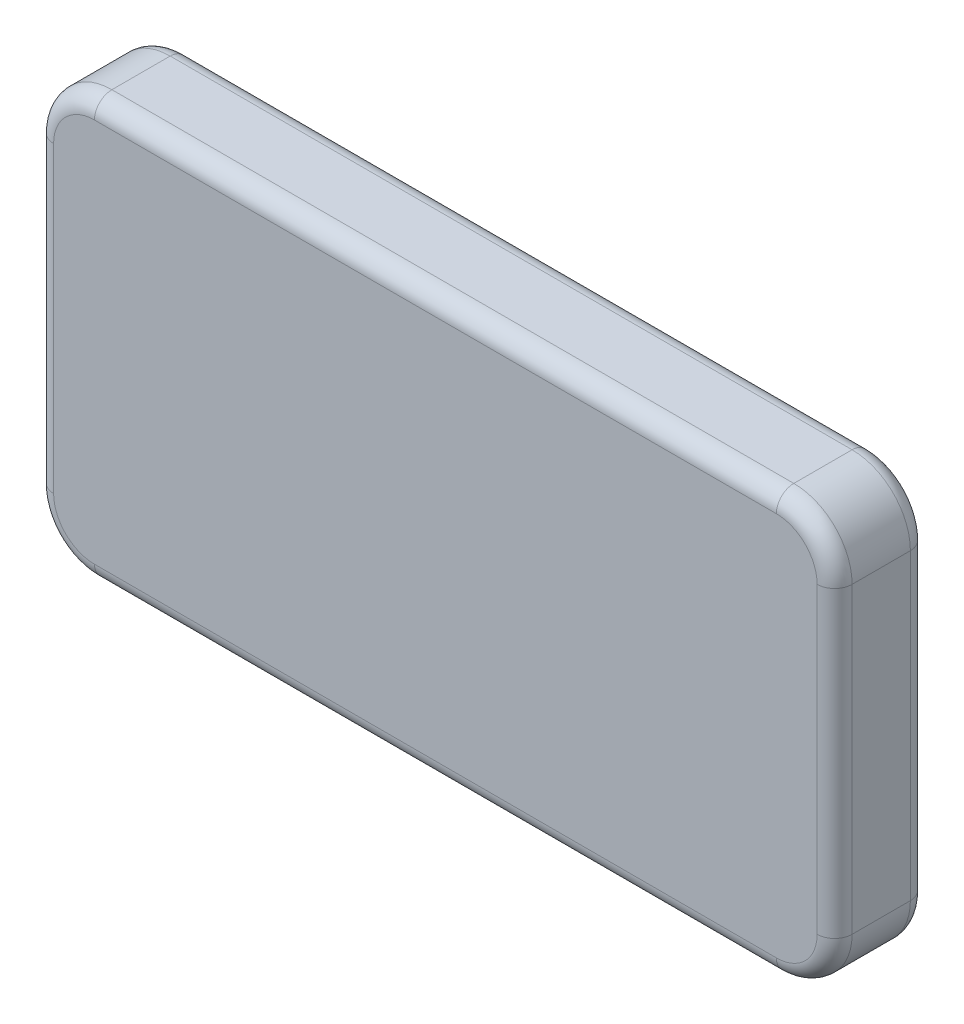
ISO-10303-21;
HEADER;
FILE_DESCRIPTION(('STEP AP214'),'2;1');
FILE_NAME('part.step','',(''),(''),'','','');
FILE_SCHEMA(('AUTOMOTIVE_DESIGN { 1 0 10303 214 1 1 1 1 }'));
ENDSEC;
DATA;
#1=APPLICATION_CONTEXT('core data for automotive mechanical design processes');
#2=APPLICATION_PROTOCOL_DEFINITION('international standard','automotive_design',2000,#1);
#3=PRODUCT_CONTEXT('',#1,'mechanical');
#4=PRODUCT('Part','Part','',(#3));
#5=PRODUCT_RELATED_PRODUCT_CATEGORY('part','',(#4));
#6=PRODUCT_DEFINITION_FORMATION('','',#4);
#7=PRODUCT_DEFINITION_CONTEXT('part definition',#1,'design');
#8=PRODUCT_DEFINITION('design','',#6,#7);
#9=PRODUCT_DEFINITION_SHAPE('','',#8);
#10=(LENGTH_UNIT() NAMED_UNIT(*) SI_UNIT(.MILLI.,.METRE.));
#11=(NAMED_UNIT(*) PLANE_ANGLE_UNIT() SI_UNIT($,.RADIAN.));
#12=(NAMED_UNIT(*) SI_UNIT($,.STERADIAN.) SOLID_ANGLE_UNIT());
#13=UNCERTAINTY_MEASURE_WITH_UNIT(LENGTH_MEASURE(1.E-05),#10,'distance_accuracy_value','');
#14=(GEOMETRIC_REPRESENTATION_CONTEXT(3) GLOBAL_UNCERTAINTY_ASSIGNED_CONTEXT((#13)) GLOBAL_UNIT_ASSIGNED_CONTEXT((#10,
#11,#12)) REPRESENTATION_CONTEXT('',''));
#15=CARTESIAN_POINT('',(0.,0.,0.));
#16=DIRECTION('',(0.,0.,1.));
#17=DIRECTION('',(1.,0.,0.));
#18=AXIS2_PLACEMENT_3D('',#15,#16,#17);
#19=CARTESIAN_POINT('',(0.,0.,16.));
#20=DIRECTION('',(-1.,0.,0.));
#21=DIRECTION('',(0.,0.,1.));
#22=AXIS2_PLACEMENT_3D('',#19,#20,#21);
#23=PLANE('',#22);
#24=DIRECTION('',(0.,0.,-1.));
#25=VECTOR('',#24,1.);
#26=CARTESIAN_POINT('',(0.,62.,16.));
#27=LINE('',#26,#25);
#28=CARTESIAN_POINT('',(0.,62.,3.));
#29=VERTEX_POINT('',#28);
#30=CARTESIAN_POINT('',(0.,62.,13.));
#31=VERTEX_POINT('',#30);
#32=EDGE_CURVE('E281',#29,#31,#27,.F.);
#33=ORIENTED_EDGE('',*,*,#32,.T.);
#34=DIRECTION('',(0.,1.,0.));
#35=VECTOR('',#34,1.);
#36=CARTESIAN_POINT('',(0.,10.,13.));
#37=LINE('',#36,#35);
#38=CARTESIAN_POINT('',(0.,10.,13.));
#39=VERTEX_POINT('',#38);
#40=EDGE_CURVE('E374',#31,#39,#37,.F.);
#41=ORIENTED_EDGE('',*,*,#40,.T.);
#42=DIRECTION('',(0.,0.,-1.));
#43=VECTOR('',#42,1.);
#44=CARTESIAN_POINT('',(0.,10.,16.));
#45=LINE('',#44,#43);
#46=CARTESIAN_POINT('',(0.,10.,3.));
#47=VERTEX_POINT('',#46);
#48=EDGE_CURVE('E284',#39,#47,#45,.T.);
#49=ORIENTED_EDGE('',*,*,#48,.T.);
#50=DIRECTION('',(0.,1.,0.));
#51=VECTOR('',#50,1.);
#52=CARTESIAN_POINT('',(0.,0.,3.));
#53=LINE('',#52,#51);
#54=EDGE_CURVE('E311',#47,#29,#53,.T.);
#55=ORIENTED_EDGE('',*,*,#54,.T.);
#56=EDGE_LOOP('',(#33,#41,#49,#55));
#57=FACE_BOUND('',#56,.T.);
#58=ADVANCED_FACE('F35',(#57),#23,.F.);
#59=CARTESIAN_POINT('',(0.,72.,16.));
#60=DIRECTION('',(0.,-1.,0.));
#61=DIRECTION('',(1.,0.,0.));
#62=AXIS2_PLACEMENT_3D('',#59,#60,#61);
#63=PLANE('',#62);
#64=DIRECTION('',(0.,0.,-1.));
#65=VECTOR('',#64,1.);
#66=CARTESIAN_POINT('',(-127.,72.,16.));
#67=LINE('',#66,#65);
#68=CARTESIAN_POINT('',(-127.,72.,3.));
#69=VERTEX_POINT('',#68);
#70=CARTESIAN_POINT('',(-127.,72.,13.));
#71=VERTEX_POINT('',#70);
#72=EDGE_CURVE('E286',#69,#71,#67,.F.);
#73=ORIENTED_EDGE('',*,*,#72,.T.);
#74=DIRECTION('',(-1.,0.,0.));
#75=VECTOR('',#74,1.);
#76=CARTESIAN_POINT('',(-10.,72.,13.));
#77=LINE('',#76,#75);
#78=CARTESIAN_POINT('',(-10.,72.,13.));
#79=VERTEX_POINT('',#78);
#80=EDGE_CURVE('E370',#71,#79,#77,.F.);
#81=ORIENTED_EDGE('',*,*,#80,.T.);
#82=DIRECTION('',(0.,0.,-1.));
#83=VECTOR('',#82,1.);
#84=CARTESIAN_POINT('',(-10.,72.,16.));
#85=LINE('',#84,#83);
#86=CARTESIAN_POINT('',(-10.,72.,3.));
#87=VERTEX_POINT('',#86);
#88=EDGE_CURVE('E289',#79,#87,#85,.T.);
#89=ORIENTED_EDGE('',*,*,#88,.T.);
#90=DIRECTION('',(-1.,0.,0.));
#91=VECTOR('',#90,1.);
#92=CARTESIAN_POINT('',(0.,72.,3.));
#93=LINE('',#92,#91);
#94=EDGE_CURVE('E316',#87,#69,#93,.T.);
#95=ORIENTED_EDGE('',*,*,#94,.T.);
#96=EDGE_LOOP('',(#73,#81,#89,#95));
#97=FACE_BOUND('',#96,.T.);
#98=ADVANCED_FACE('F449',(#97),#63,.F.);
#99=CARTESIAN_POINT('',(-137.,0.,16.));
#100=DIRECTION('',(1.,0.,0.));
#101=DIRECTION('',(0.,0.,-1.));
#102=AXIS2_PLACEMENT_3D('',#99,#100,#101);
#103=PLANE('',#102);
#104=DIRECTION('',(0.,0.,1.));
#105=VECTOR('',#104,1.);
#106=CARTESIAN_POINT('',(-137.,46.5,5.5));
#107=LINE('',#106,#105);
#108=CARTESIAN_POINT('',(-137.,46.5,5.5));
#109=VERTEX_POINT('',#108);
#110=CARTESIAN_POINT('',(-137.,46.5,10.5));
#111=VERTEX_POINT('',#110);
#112=EDGE_CURVE('E231',#109,#111,#107,.T.);
#113=ORIENTED_EDGE('',*,*,#112,.F.);
#114=DIRECTION('',(0.,-1.,0.));
#115=VECTOR('',#114,1.);
#116=CARTESIAN_POINT('',(-137.,59.,5.5));
#117=LINE('',#116,#115);
#118=CARTESIAN_POINT('',(-137.,59.,5.5));
#119=VERTEX_POINT('',#118);
#120=EDGE_CURVE('E205',#119,#109,#117,.T.);
#121=ORIENTED_EDGE('',*,*,#120,.F.);
#122=DIRECTION('',(0.,0.,-1.));
#123=VECTOR('',#122,1.);
#124=CARTESIAN_POINT('',(-137.,59.,5.5));
#125=LINE('',#124,#123);
#126=CARTESIAN_POINT('',(-137.,59.,10.5));
#127=VERTEX_POINT('',#126);
#128=EDGE_CURVE('E222',#127,#119,#125,.T.);
#129=ORIENTED_EDGE('',*,*,#128,.F.);
#130=DIRECTION('',(0.,1.,0.));
#131=VECTOR('',#130,1.);
#132=CARTESIAN_POINT('',(-137.,59.,10.5));
#133=LINE('',#132,#131);
#134=EDGE_CURVE('E225',#111,#127,#133,.T.);
#135=ORIENTED_EDGE('',*,*,#134,.F.);
#136=EDGE_LOOP('',(#113,#121,#129,#135));
#137=FACE_BOUND('',#136,.T.);
#138=DIRECTION('',(0.,0.,1.));
#139=VECTOR('',#138,1.);
#140=CARTESIAN_POINT('',(-137.,13.,5.50000000000001));
#141=LINE('',#140,#139);
#142=CARTESIAN_POINT('',(-137.,13.,5.50000000000001));
#143=VERTEX_POINT('',#142);
#144=CARTESIAN_POINT('',(-137.,13.,10.5));
#145=VERTEX_POINT('',#144);
#146=EDGE_CURVE('E258',#143,#145,#141,.T.);
#147=ORIENTED_EDGE('',*,*,#146,.F.);
#148=DIRECTION('',(0.,-1.,0.));
#149=VECTOR('',#148,1.);
#150=CARTESIAN_POINT('',(-137.,25.5,5.50000000000001));
#151=LINE('',#150,#149);
#152=CARTESIAN_POINT('',(-137.,25.5,5.50000000000001));
#153=VERTEX_POINT('',#152);
#154=EDGE_CURVE('E256',#153,#143,#151,.T.);
#155=ORIENTED_EDGE('',*,*,#154,.F.);
#156=DIRECTION('',(0.,0.,-1.));
#157=VECTOR('',#156,1.);
#158=CARTESIAN_POINT('',(-137.,25.5,5.50000000000001));
#159=LINE('',#158,#157);
#160=CARTESIAN_POINT('',(-137.,25.5,10.5));
#161=VERTEX_POINT('',#160);
#162=EDGE_CURVE('E246',#161,#153,#159,.T.);
#163=ORIENTED_EDGE('',*,*,#162,.F.);
#164=DIRECTION('',(0.,1.,0.));
#165=VECTOR('',#164,1.);
#166=CARTESIAN_POINT('',(-137.,25.5,10.5));
#167=LINE('',#166,#165);
#168=EDGE_CURVE('E262',#145,#161,#167,.T.);
#169=ORIENTED_EDGE('',*,*,#168,.F.);
#170=EDGE_LOOP('',(#147,#155,#163,#169));
#171=FACE_BOUND('',#170,.T.);
#172=DIRECTION('',(0.,0.,-1.));
#173=VECTOR('',#172,1.);
#174=CARTESIAN_POINT('',(-137.,9.99999999999998,16.));
#175=LINE('',#174,#173);
#176=CARTESIAN_POINT('',(-137.,9.99999999999998,3.));
#177=VERTEX_POINT('',#176);
#178=CARTESIAN_POINT('',(-137.,9.99999999999998,13.));
#179=VERTEX_POINT('',#178);
#180=EDGE_CURVE('E279',#177,#179,#175,.F.);
#181=ORIENTED_EDGE('',*,*,#180,.T.);
#182=DIRECTION('',(0.,-1.,0.));
#183=VECTOR('',#182,1.);
#184=CARTESIAN_POINT('',(-137.,62.,13.));
#185=LINE('',#184,#183);
#186=CARTESIAN_POINT('',(-137.,62.,13.));
#187=VERTEX_POINT('',#186);
#188=EDGE_CURVE('E11',#179,#187,#185,.F.);
#189=ORIENTED_EDGE('',*,*,#188,.T.);
#190=DIRECTION('',(0.,0.,-1.));
#191=VECTOR('',#190,1.);
#192=CARTESIAN_POINT('',(-137.,62.,16.));
#193=LINE('',#192,#191);
#194=CARTESIAN_POINT('',(-137.,62.,3.));
#195=VERTEX_POINT('',#194);
#196=EDGE_CURVE('E277',#187,#195,#193,.T.);
#197=ORIENTED_EDGE('',*,*,#196,.T.);
#198=DIRECTION('',(0.,-1.,0.));
#199=VECTOR('',#198,1.);
#200=CARTESIAN_POINT('',(-137.,0.,3.));
#201=LINE('',#200,#199);
#202=EDGE_CURVE('E321',#195,#177,#201,.T.);
#203=ORIENTED_EDGE('',*,*,#202,.T.);
#204=EDGE_LOOP('',(#181,#189,#197,#203));
#205=FACE_BOUND('',#204,.T.);
#206=ADVANCED_FACE('F466',(#137,#171,#205),#103,.F.);
#207=CARTESIAN_POINT('',(0.,0.,16.));
#208=DIRECTION('',(0.,1.,0.));
#209=DIRECTION('',(-1.,0.,0.));
#210=AXIS2_PLACEMENT_3D('',#207,#208,#209);
#211=PLANE('',#210);
#212=DIRECTION('',(0.,0.,-1.));
#213=VECTOR('',#212,1.);
#214=CARTESIAN_POINT('',(-10.,0.,16.));
#215=LINE('',#214,#213);
#216=CARTESIAN_POINT('',(-10.,0.,3.));
#217=VERTEX_POINT('',#216);
#218=CARTESIAN_POINT('',(-10.,0.,13.));
#219=VERTEX_POINT('',#218);
#220=EDGE_CURVE('E238',#217,#219,#215,.F.);
#221=ORIENTED_EDGE('',*,*,#220,.T.);
#222=DIRECTION('',(1.,0.,0.));
#223=VECTOR('',#222,1.);
#224=CARTESIAN_POINT('',(-127.,0.,13.));
#225=LINE('',#224,#223);
#226=CARTESIAN_POINT('',(-127.,0.,13.));
#227=VERTEX_POINT('',#226);
#228=EDGE_CURVE('E59',#219,#227,#225,.F.);
#229=ORIENTED_EDGE('',*,*,#228,.T.);
#230=DIRECTION('',(0.,0.,-1.));
#231=VECTOR('',#230,1.);
#232=CARTESIAN_POINT('',(-127.,0.,16.));
#233=LINE('',#232,#231);
#234=CARTESIAN_POINT('',(-127.,0.,3.));
#235=VERTEX_POINT('',#234);
#236=EDGE_CURVE('E275',#227,#235,#233,.T.);
#237=ORIENTED_EDGE('',*,*,#236,.T.);
#238=DIRECTION('',(1.,0.,0.));
#239=VECTOR('',#238,1.);
#240=CARTESIAN_POINT('',(0.,0.,3.));
#241=LINE('',#240,#239);
#242=EDGE_CURVE('E326',#235,#217,#241,.T.);
#243=ORIENTED_EDGE('',*,*,#242,.T.);
#244=EDGE_LOOP('',(#221,#229,#237,#243));
#245=FACE_BOUND('',#244,.T.);
#246=ADVANCED_FACE('F415',(#245),#211,.F.);
#247=CARTESIAN_POINT('',(0.,0.,16.));
#248=DIRECTION('',(0.,0.,1.));
#249=DIRECTION('',(1.,0.,0.));
#250=AXIS2_PLACEMENT_3D('',#247,#248,#249);
#251=PLANE('',#250);
#252=DIRECTION('',(-1.,0.,0.));
#253=VECTOR('',#252,1.);
#254=CARTESIAN_POINT('',(-127.,69.,16.));
#255=LINE('',#254,#253);
#256=CARTESIAN_POINT('',(-10.,69.,16.));
#257=VERTEX_POINT('',#256);
#258=CARTESIAN_POINT('',(-127.,69.,16.));
#259=VERTEX_POINT('',#258);
#260=EDGE_CURVE('E362',#257,#259,#255,.T.);
#261=ORIENTED_EDGE('',*,*,#260,.T.);
#262=CARTESIAN_POINT('',(-127.,62.,16.));
#263=DIRECTION('',(0.,0.,1.));
#264=DIRECTION('',(1.,0.,0.));
#265=AXIS2_PLACEMENT_3D('',#262,#263,#264);
#266=CIRCLE('',#265,7.);
#267=CARTESIAN_POINT('',(-134.,62.,16.));
#268=VERTEX_POINT('',#267);
#269=EDGE_CURVE('E364',#259,#268,#266,.T.);
#270=ORIENTED_EDGE('',*,*,#269,.T.);
#271=DIRECTION('',(0.,-1.,0.));
#272=VECTOR('',#271,1.);
#273=CARTESIAN_POINT('',(-134.,9.99999999999998,16.));
#274=LINE('',#273,#272);
#275=CARTESIAN_POINT('',(-134.,9.99999999999998,16.));
#276=VERTEX_POINT('',#275);
#277=EDGE_CURVE('E328',#268,#276,#274,.T.);
#278=ORIENTED_EDGE('',*,*,#277,.T.);
#279=CARTESIAN_POINT('',(-127.,9.99999999999998,16.));
#280=DIRECTION('',(0.,0.,1.));
#281=DIRECTION('',(1.,0.,0.));
#282=AXIS2_PLACEMENT_3D('',#279,#280,#281);
#283=CIRCLE('',#282,7.);
#284=CARTESIAN_POINT('',(-127.,2.99999999999998,16.));
#285=VERTEX_POINT('',#284);
#286=EDGE_CURVE('E352',#276,#285,#283,.T.);
#287=ORIENTED_EDGE('',*,*,#286,.T.);
#288=DIRECTION('',(1.,0.,0.));
#289=VECTOR('',#288,1.);
#290=CARTESIAN_POINT('',(-10.,3.,16.));
#291=LINE('',#290,#289);
#292=CARTESIAN_POINT('',(-10.,3.,16.));
#293=VERTEX_POINT('',#292);
#294=EDGE_CURVE('E354',#285,#293,#291,.T.);
#295=ORIENTED_EDGE('',*,*,#294,.T.);
#296=CARTESIAN_POINT('',(-10.,10.,16.));
#297=DIRECTION('',(0.,0.,1.));
#298=DIRECTION('',(1.,0.,0.));
#299=AXIS2_PLACEMENT_3D('',#296,#297,#298);
#300=CIRCLE('',#299,7.);
#301=CARTESIAN_POINT('',(-3.,10.,16.));
#302=VERTEX_POINT('',#301);
#303=EDGE_CURVE('E356',#293,#302,#300,.T.);
#304=ORIENTED_EDGE('',*,*,#303,.T.);
#305=DIRECTION('',(0.,1.,0.));
#306=VECTOR('',#305,1.);
#307=CARTESIAN_POINT('',(-3.,62.,16.));
#308=LINE('',#307,#306);
#309=CARTESIAN_POINT('',(-3.,62.,16.));
#310=VERTEX_POINT('',#309);
#311=EDGE_CURVE('E358',#302,#310,#308,.T.);
#312=ORIENTED_EDGE('',*,*,#311,.T.);
#313=CARTESIAN_POINT('',(-10.,62.,16.));
#314=DIRECTION('',(0.,0.,1.));
#315=DIRECTION('',(1.,0.,0.));
#316=AXIS2_PLACEMENT_3D('',#313,#314,#315);
#317=CIRCLE('',#316,7.);
#318=EDGE_CURVE('E360',#310,#257,#317,.T.);
#319=ORIENTED_EDGE('',*,*,#318,.T.);
#320=EDGE_LOOP('',(#261,#270,#278,#287,#295,#304,#312,#319));
#321=FACE_BOUND('',#320,.T.);
#322=ADVANCED_FACE('F477',(#321),#251,.T.);
#323=CARTESIAN_POINT('',(0.,0.,0.));
#324=DIRECTION('',(0.,0.,1.));
#325=DIRECTION('',(1.,0.,0.));
#326=AXIS2_PLACEMENT_3D('',#323,#324,#325);
#327=PLANE('',#326);
#328=DIRECTION('',(0.,1.,0.));
#329=VECTOR('',#328,1.);
#330=CARTESIAN_POINT('',(-3.,0.,0.));
#331=LINE('',#330,#329);
#332=CARTESIAN_POINT('',(-3.,62.,0.));
#333=VERTEX_POINT('',#332);
#334=CARTESIAN_POINT('',(-3.,10.,0.));
#335=VERTEX_POINT('',#334);
#336=EDGE_CURVE('E303',#333,#335,#331,.F.);
#337=ORIENTED_EDGE('',*,*,#336,.T.);
#338=CARTESIAN_POINT('',(-10.,10.,0.));
#339=DIRECTION('',(0.,0.,1.));
#340=DIRECTION('',(1.,0.,0.));
#341=AXIS2_PLACEMENT_3D('',#338,#339,#340);
#342=CIRCLE('',#341,7.);
#343=CARTESIAN_POINT('',(-10.,3.,0.));
#344=VERTEX_POINT('',#343);
#345=EDGE_CURVE('E305',#335,#344,#342,.F.);
#346=ORIENTED_EDGE('',*,*,#345,.T.);
#347=DIRECTION('',(1.,0.,0.));
#348=VECTOR('',#347,1.);
#349=CARTESIAN_POINT('',(0.,3.,0.));
#350=LINE('',#349,#348);
#351=CARTESIAN_POINT('',(-127.,2.99999999999998,0.));
#352=VERTEX_POINT('',#351);
#353=EDGE_CURVE('E291',#344,#352,#350,.F.);
#354=ORIENTED_EDGE('',*,*,#353,.T.);
#355=CARTESIAN_POINT('',(-127.,9.99999999999998,0.));
#356=DIRECTION('',(0.,0.,1.));
#357=DIRECTION('',(1.,0.,0.));
#358=AXIS2_PLACEMENT_3D('',#355,#356,#357);
#359=CIRCLE('',#358,7.);
#360=CARTESIAN_POINT('',(-134.,9.99999999999998,0.));
#361=VERTEX_POINT('',#360);
#362=EDGE_CURVE('E293',#352,#361,#359,.F.);
#363=ORIENTED_EDGE('',*,*,#362,.T.);
#364=DIRECTION('',(0.,-1.,0.));
#365=VECTOR('',#364,1.);
#366=CARTESIAN_POINT('',(-134.,0.,0.));
#367=LINE('',#366,#365);
#368=CARTESIAN_POINT('',(-134.,62.,0.));
#369=VERTEX_POINT('',#368);
#370=EDGE_CURVE('E295',#361,#369,#367,.F.);
#371=ORIENTED_EDGE('',*,*,#370,.T.);
#372=CARTESIAN_POINT('',(-127.,62.,0.));
#373=DIRECTION('',(0.,0.,1.));
#374=DIRECTION('',(1.,0.,0.));
#375=AXIS2_PLACEMENT_3D('',#372,#373,#374);
#376=CIRCLE('',#375,7.);
#377=CARTESIAN_POINT('',(-127.,69.,0.));
#378=VERTEX_POINT('',#377);
#379=EDGE_CURVE('E297',#369,#378,#376,.F.);
#380=ORIENTED_EDGE('',*,*,#379,.T.);
#381=DIRECTION('',(-1.,0.,0.));
#382=VECTOR('',#381,1.);
#383=CARTESIAN_POINT('',(0.,69.,0.));
#384=LINE('',#383,#382);
#385=CARTESIAN_POINT('',(-10.,69.,0.));
#386=VERTEX_POINT('',#385);
#387=EDGE_CURVE('E299',#378,#386,#384,.F.);
#388=ORIENTED_EDGE('',*,*,#387,.T.);
#389=CARTESIAN_POINT('',(-10.,62.,0.));
#390=DIRECTION('',(0.,0.,1.));
#391=DIRECTION('',(1.,0.,0.));
#392=AXIS2_PLACEMENT_3D('',#389,#390,#391);
#393=CIRCLE('',#392,7.);
#394=EDGE_CURVE('E301',#386,#333,#393,.F.);
#395=ORIENTED_EDGE('',*,*,#394,.T.);
#396=EDGE_LOOP('',(#337,#346,#354,#363,#371,#380,#388,#395));
#397=FACE_BOUND('',#396,.T.);
#398=ADVANCED_FACE('F474',(#397),#327,.F.);
#399=CARTESIAN_POINT('',(-125.,25.5,5.50000000000001));
#400=DIRECTION('',(0.,0.,-1.));
#401=DIRECTION('',(0.,1.,0.));
#402=AXIS2_PLACEMENT_3D('',#399,#400,#401);
#403=PLANE('',#402);
#404=ORIENTED_EDGE('',*,*,#154,.T.);
#405=DIRECTION('',(-1.,0.,0.));
#406=VECTOR('',#405,1.);
#407=CARTESIAN_POINT('',(-125.,13.,5.50000000000001));
#408=LINE('',#407,#406);
#409=CARTESIAN_POINT('',(-125.,13.,5.50000000000001));
#410=VERTEX_POINT('',#409);
#411=EDGE_CURVE('E255',#410,#143,#408,.T.);
#412=ORIENTED_EDGE('',*,*,#411,.F.);
#413=DIRECTION('',(0.,-1.,0.));
#414=VECTOR('',#413,1.);
#415=CARTESIAN_POINT('',(-125.,25.5,5.50000000000001));
#416=LINE('',#415,#414);
#417=CARTESIAN_POINT('',(-125.,25.5,5.50000000000001));
#418=VERTEX_POINT('',#417);
#419=EDGE_CURVE('E242',#418,#410,#416,.T.);
#420=ORIENTED_EDGE('',*,*,#419,.F.);
#421=DIRECTION('',(-1.,0.,0.));
#422=VECTOR('',#421,1.);
#423=CARTESIAN_POINT('',(-125.,25.5,5.50000000000001));
#424=LINE('',#423,#422);
#425=EDGE_CURVE('E232',#418,#153,#424,.T.);
#426=ORIENTED_EDGE('',*,*,#425,.T.);
#427=EDGE_LOOP('',(#404,#412,#420,#426));
#428=FACE_BOUND('',#427,.T.);
#429=ADVANCED_FACE('F476',(#428),#403,.F.);
#430=CARTESIAN_POINT('',(-125.,25.5,5.50000000000001));
#431=DIRECTION('',(0.,1.,0.));
#432=DIRECTION('',(0.,0.,1.));
#433=AXIS2_PLACEMENT_3D('',#430,#431,#432);
#434=PLANE('',#433);
#435=ORIENTED_EDGE('',*,*,#162,.T.);
#436=ORIENTED_EDGE('',*,*,#425,.F.);
#437=DIRECTION('',(0.,0.,-1.));
#438=VECTOR('',#437,1.);
#439=CARTESIAN_POINT('',(-125.,25.5,5.50000000000001));
#440=LINE('',#439,#438);
#441=CARTESIAN_POINT('',(-125.,25.5,10.5));
#442=VERTEX_POINT('',#441);
#443=EDGE_CURVE('E252',#442,#418,#440,.T.);
#444=ORIENTED_EDGE('',*,*,#443,.F.);
#445=DIRECTION('',(-1.,0.,0.));
#446=VECTOR('',#445,1.);
#447=CARTESIAN_POINT('',(-125.,25.5,10.5));
#448=LINE('',#447,#446);
#449=EDGE_CURVE('E268',#442,#161,#448,.T.);
#450=ORIENTED_EDGE('',*,*,#449,.T.);
#451=EDGE_LOOP('',(#435,#436,#444,#450));
#452=FACE_BOUND('',#451,.T.);
#453=ADVANCED_FACE('F483',(#452),#434,.F.);
#454=CARTESIAN_POINT('',(-125.,25.5,10.5));
#455=DIRECTION('',(0.,0.,1.));
#456=DIRECTION('',(1.,0.,0.));
#457=AXIS2_PLACEMENT_3D('',#454,#455,#456);
#458=PLANE('',#457);
#459=ORIENTED_EDGE('',*,*,#168,.T.);
#460=ORIENTED_EDGE('',*,*,#449,.F.);
#461=DIRECTION('',(0.,1.,0.));
#462=VECTOR('',#461,1.);
#463=CARTESIAN_POINT('',(-125.,25.5,10.5));
#464=LINE('',#463,#462);
#465=CARTESIAN_POINT('',(-125.,13.,10.5));
#466=VERTEX_POINT('',#465);
#467=EDGE_CURVE('E249',#466,#442,#464,.T.);
#468=ORIENTED_EDGE('',*,*,#467,.F.);
#469=DIRECTION('',(-1.,0.,0.));
#470=VECTOR('',#469,1.);
#471=CARTESIAN_POINT('',(-125.,13.,10.5));
#472=LINE('',#471,#470);
#473=EDGE_CURVE('E270',#466,#145,#472,.T.);
#474=ORIENTED_EDGE('',*,*,#473,.T.);
#475=EDGE_LOOP('',(#459,#460,#468,#474));
#476=FACE_BOUND('',#475,.T.);
#477=ADVANCED_FACE('F647',(#476),#458,.F.);
#478=CARTESIAN_POINT('',(-125.,13.,5.50000000000001));
#479=DIRECTION('',(0.,-1.,0.));
#480=DIRECTION('',(0.,0.,-1.));
#481=AXIS2_PLACEMENT_3D('',#478,#479,#480);
#482=PLANE('',#481);
#483=ORIENTED_EDGE('',*,*,#146,.T.);
#484=ORIENTED_EDGE('',*,*,#473,.F.);
#485=DIRECTION('',(0.,0.,1.));
#486=VECTOR('',#485,1.);
#487=CARTESIAN_POINT('',(-125.,13.,5.50000000000001));
#488=LINE('',#487,#486);
#489=EDGE_CURVE('E245',#410,#466,#488,.T.);
#490=ORIENTED_EDGE('',*,*,#489,.F.);
#491=ORIENTED_EDGE('',*,*,#411,.T.);
#492=EDGE_LOOP('',(#483,#484,#490,#491));
#493=FACE_BOUND('',#492,.T.);
#494=ADVANCED_FACE('F639',(#493),#482,.F.);
#495=CARTESIAN_POINT('',(-125.,0.,0.));
#496=DIRECTION('',(-1.,0.,0.));
#497=DIRECTION('',(0.,0.,1.));
#498=AXIS2_PLACEMENT_3D('',#495,#496,#497);
#499=PLANE('',#498);
#500=ORIENTED_EDGE('',*,*,#419,.T.);
#501=ORIENTED_EDGE('',*,*,#489,.T.);
#502=ORIENTED_EDGE('',*,*,#467,.T.);
#503=ORIENTED_EDGE('',*,*,#443,.T.);
#504=EDGE_LOOP('',(#500,#501,#502,#503));
#505=FACE_BOUND('',#504,.T.);
#506=ADVANCED_FACE('F632',(#505),#499,.T.);
#507=CARTESIAN_POINT('',(-125.,59.,5.5));
#508=DIRECTION('',(0.,0.,-1.));
#509=DIRECTION('',(-1.,0.,0.));
#510=AXIS2_PLACEMENT_3D('',#507,#508,#509);
#511=PLANE('',#510);
#512=ORIENTED_EDGE('',*,*,#120,.T.);
#513=DIRECTION('',(-1.,0.,0.));
#514=VECTOR('',#513,1.);
#515=CARTESIAN_POINT('',(-125.,46.5,5.5));
#516=LINE('',#515,#514);
#517=CARTESIAN_POINT('',(-125.,46.5,5.5));
#518=VERTEX_POINT('',#517);
#519=EDGE_CURVE('E198',#518,#109,#516,.T.);
#520=ORIENTED_EDGE('',*,*,#519,.F.);
#521=DIRECTION('',(0.,-1.,0.));
#522=VECTOR('',#521,1.);
#523=CARTESIAN_POINT('',(-125.,59.,5.5));
#524=LINE('',#523,#522);
#525=CARTESIAN_POINT('',(-125.,59.,5.5));
#526=VERTEX_POINT('',#525);
#527=EDGE_CURVE('E202',#526,#518,#524,.T.);
#528=ORIENTED_EDGE('',*,*,#527,.F.);
#529=DIRECTION('',(-1.,0.,0.));
#530=VECTOR('',#529,1.);
#531=CARTESIAN_POINT('',(-125.,59.,5.5));
#532=LINE('',#531,#530);
#533=EDGE_CURVE('E236',#526,#119,#532,.T.);
#534=ORIENTED_EDGE('',*,*,#533,.T.);
#535=EDGE_LOOP('',(#512,#520,#528,#534));
#536=FACE_BOUND('',#535,.T.);
#537=ADVANCED_FACE('F200',(#536),#511,.F.);
#538=CARTESIAN_POINT('',(-125.,59.,5.5));
#539=DIRECTION('',(0.,1.,0.));
#540=DIRECTION('',(0.,0.,1.));
#541=AXIS2_PLACEMENT_3D('',#538,#539,#540);
#542=PLANE('',#541);
#543=ORIENTED_EDGE('',*,*,#128,.T.);
#544=ORIENTED_EDGE('',*,*,#533,.F.);
#545=DIRECTION('',(0.,0.,-1.));
#546=VECTOR('',#545,1.);
#547=CARTESIAN_POINT('',(-125.,59.,5.5));
#548=LINE('',#547,#546);
#549=CARTESIAN_POINT('',(-125.,59.,10.5));
#550=VERTEX_POINT('',#549);
#551=EDGE_CURVE('E210',#550,#526,#548,.T.);
#552=ORIENTED_EDGE('',*,*,#551,.F.);
#553=DIRECTION('',(-1.,0.,0.));
#554=VECTOR('',#553,1.);
#555=CARTESIAN_POINT('',(-125.,59.,10.5));
#556=LINE('',#555,#554);
#557=EDGE_CURVE('E239',#550,#127,#556,.T.);
#558=ORIENTED_EDGE('',*,*,#557,.T.);
#559=EDGE_LOOP('',(#543,#544,#552,#558));
#560=FACE_BOUND('',#559,.T.);
#561=ADVANCED_FACE('F617',(#560),#542,.F.);
#562=CARTESIAN_POINT('',(-125.,59.,10.5));
#563=DIRECTION('',(0.,0.,1.));
#564=DIRECTION('',(0.,-1.,0.));
#565=AXIS2_PLACEMENT_3D('',#562,#563,#564);
#566=PLANE('',#565);
#567=ORIENTED_EDGE('',*,*,#134,.T.);
#568=ORIENTED_EDGE('',*,*,#557,.F.);
#569=DIRECTION('',(0.,1.,0.));
#570=VECTOR('',#569,1.);
#571=CARTESIAN_POINT('',(-125.,59.,10.5));
#572=LINE('',#571,#570);
#573=CARTESIAN_POINT('',(-125.,46.5,10.5));
#574=VERTEX_POINT('',#573);
#575=EDGE_CURVE('E218',#574,#550,#572,.T.);
#576=ORIENTED_EDGE('',*,*,#575,.F.);
#577=DIRECTION('',(-1.,0.,0.));
#578=VECTOR('',#577,1.);
#579=CARTESIAN_POINT('',(-125.,46.5,10.5));
#580=LINE('',#579,#578);
#581=EDGE_CURVE('E209',#574,#111,#580,.T.);
#582=ORIENTED_EDGE('',*,*,#581,.T.);
#583=EDGE_LOOP('',(#567,#568,#576,#582));
#584=FACE_BOUND('',#583,.T.);
#585=ADVANCED_FACE('F610',(#584),#566,.F.);
#586=CARTESIAN_POINT('',(-125.,46.5,5.5));
#587=DIRECTION('',(0.,-1.,0.));
#588=DIRECTION('',(0.,0.,-1.));
#589=AXIS2_PLACEMENT_3D('',#586,#587,#588);
#590=PLANE('',#589);
#591=ORIENTED_EDGE('',*,*,#112,.T.);
#592=ORIENTED_EDGE('',*,*,#581,.F.);
#593=DIRECTION('',(0.,0.,1.));
#594=VECTOR('',#593,1.);
#595=CARTESIAN_POINT('',(-125.,46.5,5.5));
#596=LINE('',#595,#594);
#597=EDGE_CURVE('E213',#518,#574,#596,.T.);
#598=ORIENTED_EDGE('',*,*,#597,.F.);
#599=ORIENTED_EDGE('',*,*,#519,.T.);
#600=EDGE_LOOP('',(#591,#592,#598,#599));
#601=FACE_BOUND('',#600,.T.);
#602=ADVANCED_FACE('F214',(#601),#590,.F.);
#603=CARTESIAN_POINT('',(-125.,0.,0.));
#604=DIRECTION('',(-1.,0.,0.));
#605=DIRECTION('',(0.,0.,1.));
#606=AXIS2_PLACEMENT_3D('',#603,#604,#605);
#607=PLANE('',#606);
#608=ORIENTED_EDGE('',*,*,#527,.T.);
#609=ORIENTED_EDGE('',*,*,#597,.T.);
#610=ORIENTED_EDGE('',*,*,#575,.T.);
#611=ORIENTED_EDGE('',*,*,#551,.T.);
#612=EDGE_LOOP('',(#608,#609,#610,#611));
#613=FACE_BOUND('',#612,.T.);
#614=ADVANCED_FACE('F220',(#613),#607,.T.);
#615=CARTESIAN_POINT('',(-127.,9.99999999999998,16.));
#616=DIRECTION('',(0.,0.,-1.));
#617=DIRECTION('',(-1.,0.,0.));
#618=AXIS2_PLACEMENT_3D('',#615,#616,#617);
#619=CYLINDRICAL_SURFACE('',#618,10.);
#620=ORIENTED_EDGE('',*,*,#236,.F.);
#621=CARTESIAN_POINT('',(-127.,9.99999999999998,13.));
#622=DIRECTION('',(0.,0.,1.));
#623=DIRECTION('',(1.,0.,0.));
#624=AXIS2_PLACEMENT_3D('',#621,#622,#623);
#625=CIRCLE('',#624,10.);
#626=EDGE_CURVE('E44',#227,#179,#625,.F.);
#627=ORIENTED_EDGE('',*,*,#626,.T.);
#628=ORIENTED_EDGE('',*,*,#180,.F.);
#629=CARTESIAN_POINT('',(-127.,9.99999999999998,3.));
#630=DIRECTION('',(0.,0.,1.));
#631=DIRECTION('',(1.,0.,0.));
#632=AXIS2_PLACEMENT_3D('',#629,#630,#631);
#633=CIRCLE('',#632,10.);
#634=EDGE_CURVE('E323',#177,#235,#633,.T.);
#635=ORIENTED_EDGE('',*,*,#634,.T.);
#636=EDGE_LOOP('',(#620,#627,#628,#635));
#637=FACE_BOUND('',#636,.T.);
#638=ADVANCED_FACE('F468',(#637),#619,.T.);
#639=CARTESIAN_POINT('',(-10.,10.,16.));
#640=DIRECTION('',(0.,0.,-1.));
#641=DIRECTION('',(-1.,0.,0.));
#642=AXIS2_PLACEMENT_3D('',#639,#640,#641);
#643=CYLINDRICAL_SURFACE('',#642,10.);
#644=ORIENTED_EDGE('',*,*,#48,.F.);
#645=CARTESIAN_POINT('',(-10.,10.,13.));
#646=DIRECTION('',(0.,0.,1.));
#647=DIRECTION('',(1.,0.,0.));
#648=AXIS2_PLACEMENT_3D('',#645,#646,#647);
#649=CIRCLE('',#648,10.);
#650=EDGE_CURVE('E376',#39,#219,#649,.F.);
#651=ORIENTED_EDGE('',*,*,#650,.T.);
#652=ORIENTED_EDGE('',*,*,#220,.F.);
#653=CARTESIAN_POINT('',(-10.,10.,3.));
#654=DIRECTION('',(0.,0.,1.));
#655=DIRECTION('',(1.,0.,0.));
#656=AXIS2_PLACEMENT_3D('',#653,#654,#655);
#657=CIRCLE('',#656,10.);
#658=EDGE_CURVE('E308',#217,#47,#657,.T.);
#659=ORIENTED_EDGE('',*,*,#658,.T.);
#660=EDGE_LOOP('',(#644,#651,#652,#659));
#661=FACE_BOUND('',#660,.T.);
#662=ADVANCED_FACE('F413',(#661),#643,.T.);
#663=CARTESIAN_POINT('',(-10.,62.,16.));
#664=DIRECTION('',(0.,0.,-1.));
#665=DIRECTION('',(-1.,0.,0.));
#666=AXIS2_PLACEMENT_3D('',#663,#664,#665);
#667=CYLINDRICAL_SURFACE('',#666,10.);
#668=ORIENTED_EDGE('',*,*,#88,.F.);
#669=CARTESIAN_POINT('',(-10.,62.,13.));
#670=DIRECTION('',(0.,0.,1.));
#671=DIRECTION('',(1.,0.,0.));
#672=AXIS2_PLACEMENT_3D('',#669,#670,#671);
#673=CIRCLE('',#672,10.);
#674=EDGE_CURVE('E372',#79,#31,#673,.F.);
#675=ORIENTED_EDGE('',*,*,#674,.T.);
#676=ORIENTED_EDGE('',*,*,#32,.F.);
#677=CARTESIAN_POINT('',(-10.,62.,3.));
#678=DIRECTION('',(0.,0.,1.));
#679=DIRECTION('',(1.,0.,0.));
#680=AXIS2_PLACEMENT_3D('',#677,#678,#679);
#681=CIRCLE('',#680,10.);
#682=EDGE_CURVE('E313',#29,#87,#681,.T.);
#683=ORIENTED_EDGE('',*,*,#682,.T.);
#684=EDGE_LOOP('',(#668,#675,#676,#683));
#685=FACE_BOUND('',#684,.T.);
#686=ADVANCED_FACE('F436',(#685),#667,.T.);
#687=CARTESIAN_POINT('',(-127.,62.,16.));
#688=DIRECTION('',(0.,0.,-1.));
#689=DIRECTION('',(-1.,0.,0.));
#690=AXIS2_PLACEMENT_3D('',#687,#688,#689);
#691=CYLINDRICAL_SURFACE('',#690,10.);
#692=ORIENTED_EDGE('',*,*,#196,.F.);
#693=CARTESIAN_POINT('',(-127.,62.,13.));
#694=DIRECTION('',(0.,0.,1.));
#695=DIRECTION('',(1.,0.,0.));
#696=AXIS2_PLACEMENT_3D('',#693,#694,#695);
#697=CIRCLE('',#696,10.);
#698=EDGE_CURVE('E367',#187,#71,#697,.F.);
#699=ORIENTED_EDGE('',*,*,#698,.T.);
#700=ORIENTED_EDGE('',*,*,#72,.F.);
#701=CARTESIAN_POINT('',(-127.,62.,3.));
#702=DIRECTION('',(0.,0.,1.));
#703=DIRECTION('',(1.,0.,0.));
#704=AXIS2_PLACEMENT_3D('',#701,#702,#703);
#705=CIRCLE('',#704,10.);
#706=EDGE_CURVE('E318',#69,#195,#705,.T.);
#707=ORIENTED_EDGE('',*,*,#706,.T.);
#708=EDGE_LOOP('',(#692,#699,#700,#707));
#709=FACE_BOUND('',#708,.T.);
#710=ADVANCED_FACE('F453',(#709),#691,.T.);
#711=CARTESIAN_POINT('',(-127.,62.,3.));
#712=DIRECTION('',(0.,0.,1.));
#713=DIRECTION('',(1.,0.,0.));
#714=AXIS2_PLACEMENT_3D('',#711,#712,#713);
#715=TOROIDAL_SURFACE('',#714,7.,3.);
#716=CARTESIAN_POINT('',(-134.,62.,3.));
#717=DIRECTION('',(0.,-1.,0.));
#718=DIRECTION('',(0.,0.,-1.));
#719=AXIS2_PLACEMENT_3D('',#716,#717,#718);
#720=CIRCLE('',#719,3.);
#721=EDGE_CURVE('E346',#195,#369,#720,.T.);
#722=ORIENTED_EDGE('',*,*,#721,.F.);
#723=ORIENTED_EDGE('',*,*,#706,.F.);
#724=CARTESIAN_POINT('',(-127.,69.,3.));
#725=DIRECTION('',(1.,0.,0.));
#726=DIRECTION('',(0.,0.,-1.));
#727=AXIS2_PLACEMENT_3D('',#724,#725,#726);
#728=CIRCLE('',#727,3.);
#729=EDGE_CURVE('E259',#378,#69,#728,.T.);
#730=ORIENTED_EDGE('',*,*,#729,.F.);
#731=ORIENTED_EDGE('',*,*,#379,.F.);
#732=EDGE_LOOP('',(#722,#723,#730,#731));
#733=FACE_BOUND('',#732,.T.);
#734=ADVANCED_FACE('F457',(#733),#715,.T.);
#735=CARTESIAN_POINT('',(0.,69.,3.));
#736=DIRECTION('',(-1.,0.,0.));
#737=DIRECTION('',(0.,-1.,0.));
#738=AXIS2_PLACEMENT_3D('',#735,#736,#737);
#739=CYLINDRICAL_SURFACE('',#738,3.);
#740=ORIENTED_EDGE('',*,*,#729,.T.);
#741=ORIENTED_EDGE('',*,*,#94,.F.);
#742=CARTESIAN_POINT('',(-10.,69.,3.));
#743=DIRECTION('',(1.,0.,0.));
#744=DIRECTION('',(0.,0.,-1.));
#745=AXIS2_PLACEMENT_3D('',#742,#743,#744);
#746=CIRCLE('',#745,3.);
#747=EDGE_CURVE('E343',#386,#87,#746,.T.);
#748=ORIENTED_EDGE('',*,*,#747,.F.);
#749=ORIENTED_EDGE('',*,*,#387,.F.);
#750=EDGE_LOOP('',(#740,#741,#748,#749));
#751=FACE_BOUND('',#750,.T.);
#752=ADVANCED_FACE('F445',(#751),#739,.T.);
#753=CARTESIAN_POINT('',(-134.,0.,3.));
#754=DIRECTION('',(0.,-1.,0.));
#755=DIRECTION('',(0.,0.,-1.));
#756=AXIS2_PLACEMENT_3D('',#753,#754,#755);
#757=CYLINDRICAL_SURFACE('',#756,3.);
#758=ORIENTED_EDGE('',*,*,#721,.T.);
#759=ORIENTED_EDGE('',*,*,#370,.F.);
#760=CARTESIAN_POINT('',(-134.,9.99999999999998,3.));
#761=DIRECTION('',(0.,-1.,0.));
#762=DIRECTION('',(0.,0.,-1.));
#763=AXIS2_PLACEMENT_3D('',#760,#761,#762);
#764=CIRCLE('',#763,3.);
#765=EDGE_CURVE('E340',#177,#361,#764,.T.);
#766=ORIENTED_EDGE('',*,*,#765,.F.);
#767=ORIENTED_EDGE('',*,*,#202,.F.);
#768=EDGE_LOOP('',(#758,#759,#766,#767));
#769=FACE_BOUND('',#768,.T.);
#770=ADVANCED_FACE('F463',(#769),#757,.T.);
#771=CARTESIAN_POINT('',(-10.,62.,3.));
#772=DIRECTION('',(0.,0.,1.));
#773=DIRECTION('',(1.,0.,0.));
#774=AXIS2_PLACEMENT_3D('',#771,#772,#773);
#775=TOROIDAL_SURFACE('',#774,7.,3.);
#776=ORIENTED_EDGE('',*,*,#747,.T.);
#777=ORIENTED_EDGE('',*,*,#682,.F.);
#778=CARTESIAN_POINT('',(-3.,62.,3.));
#779=DIRECTION('',(0.,-1.,0.));
#780=DIRECTION('',(0.,0.,-1.));
#781=AXIS2_PLACEMENT_3D('',#778,#779,#780);
#782=CIRCLE('',#781,3.);
#783=EDGE_CURVE('E337',#333,#29,#782,.T.);
#784=ORIENTED_EDGE('',*,*,#783,.F.);
#785=ORIENTED_EDGE('',*,*,#394,.F.);
#786=EDGE_LOOP('',(#776,#777,#784,#785));
#787=FACE_BOUND('',#786,.T.);
#788=ADVANCED_FACE('F440',(#787),#775,.T.);
#789=CARTESIAN_POINT('',(-127.,9.99999999999998,3.));
#790=DIRECTION('',(0.,0.,1.));
#791=DIRECTION('',(1.,0.,0.));
#792=AXIS2_PLACEMENT_3D('',#789,#790,#791);
#793=TOROIDAL_SURFACE('',#792,7.,3.);
#794=ORIENTED_EDGE('',*,*,#765,.T.);
#795=ORIENTED_EDGE('',*,*,#362,.F.);
#796=CARTESIAN_POINT('',(-127.,2.99999999999998,3.));
#797=DIRECTION('',(1.,0.,0.));
#798=DIRECTION('',(0.,0.,-1.));
#799=AXIS2_PLACEMENT_3D('',#796,#797,#798);
#800=CIRCLE('',#799,3.);
#801=EDGE_CURVE('E334',#235,#352,#800,.T.);
#802=ORIENTED_EDGE('',*,*,#801,.F.);
#803=ORIENTED_EDGE('',*,*,#634,.F.);
#804=EDGE_LOOP('',(#794,#795,#802,#803));
#805=FACE_BOUND('',#804,.T.);
#806=ADVANCED_FACE('F472',(#805),#793,.T.);
#807=CARTESIAN_POINT('',(-3.,0.,3.));
#808=DIRECTION('',(0.,1.,0.));
#809=DIRECTION('',(0.,0.,1.));
#810=AXIS2_PLACEMENT_3D('',#807,#808,#809);
#811=CYLINDRICAL_SURFACE('',#810,3.);
#812=ORIENTED_EDGE('',*,*,#783,.T.);
#813=ORIENTED_EDGE('',*,*,#54,.F.);
#814=CARTESIAN_POINT('',(-3.,10.,3.));
#815=DIRECTION('',(0.,-1.,0.));
#816=DIRECTION('',(0.,0.,-1.));
#817=AXIS2_PLACEMENT_3D('',#814,#815,#816);
#818=CIRCLE('',#817,3.);
#819=EDGE_CURVE('E331',#335,#47,#818,.T.);
#820=ORIENTED_EDGE('',*,*,#819,.F.);
#821=ORIENTED_EDGE('',*,*,#336,.F.);
#822=EDGE_LOOP('',(#812,#813,#820,#821));
#823=FACE_BOUND('',#822,.T.);
#824=ADVANCED_FACE('F429',(#823),#811,.T.);
#825=CARTESIAN_POINT('',(0.,3.,3.));
#826=DIRECTION('',(1.,0.,0.));
#827=DIRECTION('',(0.,1.,0.));
#828=AXIS2_PLACEMENT_3D('',#825,#826,#827);
#829=CYLINDRICAL_SURFACE('',#828,3.);
#830=ORIENTED_EDGE('',*,*,#801,.T.);
#831=ORIENTED_EDGE('',*,*,#353,.F.);
#832=CARTESIAN_POINT('',(-10.,3.,3.));
#833=DIRECTION('',(1.,0.,0.));
#834=DIRECTION('',(0.,0.,-1.));
#835=AXIS2_PLACEMENT_3D('',#832,#833,#834);
#836=CIRCLE('',#835,3.);
#837=EDGE_CURVE('E329',#217,#344,#836,.T.);
#838=ORIENTED_EDGE('',*,*,#837,.F.);
#839=ORIENTED_EDGE('',*,*,#242,.F.);
#840=EDGE_LOOP('',(#830,#831,#838,#839));
#841=FACE_BOUND('',#840,.T.);
#842=ADVANCED_FACE('F419',(#841),#829,.T.);
#843=CARTESIAN_POINT('',(-10.,10.,3.));
#844=DIRECTION('',(0.,0.,1.));
#845=DIRECTION('',(1.,0.,0.));
#846=AXIS2_PLACEMENT_3D('',#843,#844,#845);
#847=TOROIDAL_SURFACE('',#846,7.,3.);
#848=ORIENTED_EDGE('',*,*,#819,.T.);
#849=ORIENTED_EDGE('',*,*,#658,.F.);
#850=ORIENTED_EDGE('',*,*,#837,.T.);
#851=ORIENTED_EDGE('',*,*,#345,.F.);
#852=EDGE_LOOP('',(#848,#849,#850,#851));
#853=FACE_BOUND('',#852,.T.);
#854=ADVANCED_FACE('F424',(#853),#847,.T.);
#855=CARTESIAN_POINT('',(-10.,10.,13.));
#856=DIRECTION('',(0.,0.,1.));
#857=DIRECTION('',(1.,0.,0.));
#858=AXIS2_PLACEMENT_3D('',#855,#856,#857);
#859=TOROIDAL_SURFACE('',#858,7.,3.);
#860=CARTESIAN_POINT('',(-10.,3.,13.));
#861=DIRECTION('',(-1.,0.,0.));
#862=DIRECTION('',(0.,0.,1.));
#863=AXIS2_PLACEMENT_3D('',#860,#861,#862);
#864=CIRCLE('',#863,3.);
#865=EDGE_CURVE('E395',#219,#293,#864,.T.);
#866=ORIENTED_EDGE('',*,*,#865,.F.);
#867=ORIENTED_EDGE('',*,*,#650,.F.);
#868=CARTESIAN_POINT('',(-3.,10.,13.));
#869=DIRECTION('',(0.,1.,0.));
#870=DIRECTION('',(0.,0.,1.));
#871=AXIS2_PLACEMENT_3D('',#868,#869,#870);
#872=CIRCLE('',#871,3.);
#873=EDGE_CURVE('E39',#302,#39,#872,.T.);
#874=ORIENTED_EDGE('',*,*,#873,.F.);
#875=ORIENTED_EDGE('',*,*,#303,.F.);
#876=EDGE_LOOP('',(#866,#867,#874,#875));
#877=FACE_BOUND('',#876,.T.);
#878=ADVANCED_FACE('F37',(#877),#859,.T.);
#879=CARTESIAN_POINT('',(-3.,0.,13.));
#880=DIRECTION('',(0.,-1.,0.));
#881=DIRECTION('',(0.,0.,-1.));
#882=AXIS2_PLACEMENT_3D('',#879,#880,#881);
#883=CYLINDRICAL_SURFACE('',#882,3.);
#884=ORIENTED_EDGE('',*,*,#873,.T.);
#885=ORIENTED_EDGE('',*,*,#40,.F.);
#886=CARTESIAN_POINT('',(-3.,62.,13.));
#887=DIRECTION('',(0.,1.,0.));
#888=DIRECTION('',(0.,0.,1.));
#889=AXIS2_PLACEMENT_3D('',#886,#887,#888);
#890=CIRCLE('',#889,3.);
#891=EDGE_CURVE('E393',#310,#31,#890,.T.);
#892=ORIENTED_EDGE('',*,*,#891,.F.);
#893=ORIENTED_EDGE('',*,*,#311,.F.);
#894=EDGE_LOOP('',(#884,#885,#892,#893));
#895=FACE_BOUND('',#894,.T.);
#896=ADVANCED_FACE('F405',(#895),#883,.T.);
#897=CARTESIAN_POINT('',(0.,3.,13.));
#898=DIRECTION('',(-1.,0.,0.));
#899=DIRECTION('',(0.,-1.,0.));
#900=AXIS2_PLACEMENT_3D('',#897,#898,#899);
#901=CYLINDRICAL_SURFACE('',#900,3.);
#902=ORIENTED_EDGE('',*,*,#865,.T.);
#903=ORIENTED_EDGE('',*,*,#294,.F.);
#904=CARTESIAN_POINT('',(-127.,2.99999999999998,13.));
#905=DIRECTION('',(-1.,0.,0.));
#906=DIRECTION('',(0.,0.,1.));
#907=AXIS2_PLACEMENT_3D('',#904,#905,#906);
#908=CIRCLE('',#907,3.);
#909=EDGE_CURVE('E390',#227,#285,#908,.T.);
#910=ORIENTED_EDGE('',*,*,#909,.F.);
#911=ORIENTED_EDGE('',*,*,#228,.F.);
#912=EDGE_LOOP('',(#902,#903,#910,#911));
#913=FACE_BOUND('',#912,.T.);
#914=ADVANCED_FACE('F540',(#913),#901,.T.);
#915=CARTESIAN_POINT('',(-10.,62.,13.));
#916=DIRECTION('',(0.,0.,1.));
#917=DIRECTION('',(1.,0.,0.));
#918=AXIS2_PLACEMENT_3D('',#915,#916,#917);
#919=TOROIDAL_SURFACE('',#918,7.,3.);
#920=ORIENTED_EDGE('',*,*,#891,.T.);
#921=ORIENTED_EDGE('',*,*,#674,.F.);
#922=CARTESIAN_POINT('',(-10.,69.,13.));
#923=DIRECTION('',(-1.,0.,0.));
#924=DIRECTION('',(0.,0.,1.));
#925=AXIS2_PLACEMENT_3D('',#922,#923,#924);
#926=CIRCLE('',#925,3.);
#927=EDGE_CURVE('E387',#257,#79,#926,.T.);
#928=ORIENTED_EDGE('',*,*,#927,.F.);
#929=ORIENTED_EDGE('',*,*,#318,.F.);
#930=EDGE_LOOP('',(#920,#921,#928,#929));
#931=FACE_BOUND('',#930,.T.);
#932=ADVANCED_FACE('F536',(#931),#919,.T.);
#933=CARTESIAN_POINT('',(-127.,9.99999999999998,13.));
#934=DIRECTION('',(0.,0.,1.));
#935=DIRECTION('',(1.,0.,0.));
#936=AXIS2_PLACEMENT_3D('',#933,#934,#935);
#937=TOROIDAL_SURFACE('',#936,7.,3.);
#938=ORIENTED_EDGE('',*,*,#909,.T.);
#939=ORIENTED_EDGE('',*,*,#286,.F.);
#940=CARTESIAN_POINT('',(-134.,9.99999999999998,13.));
#941=DIRECTION('',(0.,1.,0.));
#942=DIRECTION('',(0.,0.,1.));
#943=AXIS2_PLACEMENT_3D('',#940,#941,#942);
#944=CIRCLE('',#943,3.);
#945=EDGE_CURVE('E384',#179,#276,#944,.T.);
#946=ORIENTED_EDGE('',*,*,#945,.F.);
#947=ORIENTED_EDGE('',*,*,#626,.F.);
#948=EDGE_LOOP('',(#938,#939,#946,#947));
#949=FACE_BOUND('',#948,.T.);
#950=ADVANCED_FACE('F532',(#949),#937,.T.);
#951=CARTESIAN_POINT('',(0.,69.,13.));
#952=DIRECTION('',(1.,0.,0.));
#953=DIRECTION('',(0.,1.,0.));
#954=AXIS2_PLACEMENT_3D('',#951,#952,#953);
#955=CYLINDRICAL_SURFACE('',#954,3.);
#956=ORIENTED_EDGE('',*,*,#927,.T.);
#957=ORIENTED_EDGE('',*,*,#80,.F.);
#958=CARTESIAN_POINT('',(-127.,69.,13.));
#959=DIRECTION('',(-1.,0.,0.));
#960=DIRECTION('',(0.,0.,1.));
#961=AXIS2_PLACEMENT_3D('',#958,#959,#960);
#962=CIRCLE('',#961,3.);
#963=EDGE_CURVE('E382',#259,#71,#962,.T.);
#964=ORIENTED_EDGE('',*,*,#963,.F.);
#965=ORIENTED_EDGE('',*,*,#260,.F.);
#966=EDGE_LOOP('',(#956,#957,#964,#965));
#967=FACE_BOUND('',#966,.T.);
#968=ADVANCED_FACE('F528',(#967),#955,.T.);
#969=CARTESIAN_POINT('',(-134.,0.,13.));
#970=DIRECTION('',(0.,1.,0.));
#971=DIRECTION('',(0.,0.,1.));
#972=AXIS2_PLACEMENT_3D('',#969,#970,#971);
#973=CYLINDRICAL_SURFACE('',#972,3.);
#974=ORIENTED_EDGE('',*,*,#945,.T.);
#975=ORIENTED_EDGE('',*,*,#277,.F.);
#976=CARTESIAN_POINT('',(-134.,62.,13.));
#977=DIRECTION('',(0.,1.,0.));
#978=DIRECTION('',(0.,0.,1.));
#979=AXIS2_PLACEMENT_3D('',#976,#977,#978);
#980=CIRCLE('',#979,3.);
#981=EDGE_CURVE('E380',#187,#268,#980,.T.);
#982=ORIENTED_EDGE('',*,*,#981,.F.);
#983=ORIENTED_EDGE('',*,*,#188,.F.);
#984=EDGE_LOOP('',(#974,#975,#982,#983));
#985=FACE_BOUND('',#984,.T.);
#986=ADVANCED_FACE('F524',(#985),#973,.T.);
#987=CARTESIAN_POINT('',(-127.,62.,13.));
#988=DIRECTION('',(0.,0.,1.));
#989=DIRECTION('',(1.,0.,0.));
#990=AXIS2_PLACEMENT_3D('',#987,#988,#989);
#991=TOROIDAL_SURFACE('',#990,7.,3.);
#992=ORIENTED_EDGE('',*,*,#963,.T.);
#993=ORIENTED_EDGE('',*,*,#698,.F.);
#994=ORIENTED_EDGE('',*,*,#981,.T.);
#995=ORIENTED_EDGE('',*,*,#269,.F.);
#996=EDGE_LOOP('',(#992,#993,#994,#995));
#997=FACE_BOUND('',#996,.T.);
#998=ADVANCED_FACE('F521',(#997),#991,.T.);
#999=CLOSED_SHELL('',(#58,#98,#206,#246,#322,#398,#429,#453,#477,#494,#506,#537,#561,#585,#602,
#614,#638,#662,#686,#710,#734,#752,#770,#788,#806,#824,#842,#854,#878,#896,#914,#932,#950,#968,
#986,#998));
#1000=MANIFOLD_SOLID_BREP('B2',#999);
#1001=ADVANCED_BREP_SHAPE_REPRESENTATION('',(#18,#1000),#14);
#1002=SHAPE_DEFINITION_REPRESENTATION(#9,#1001);
ENDSEC;
END-ISO-10303-21;
